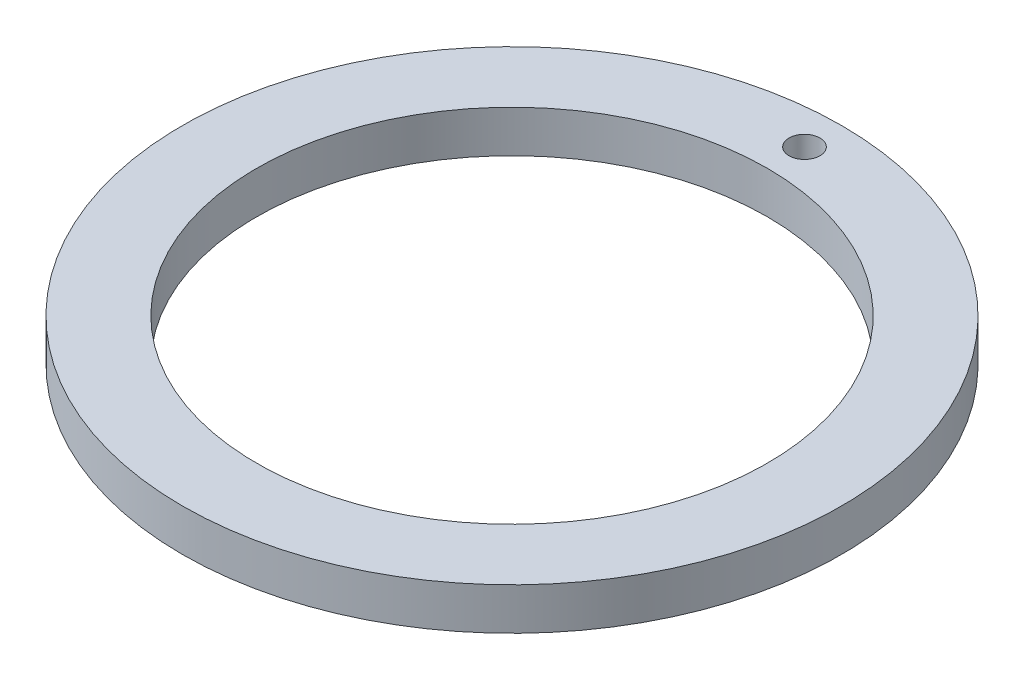
ISO-10303-21;
HEADER;
FILE_DESCRIPTION(('STEP AP214'),'2;1');
FILE_NAME('part.step','',(''),(''),'','','');
FILE_SCHEMA(('AUTOMOTIVE_DESIGN { 1 0 10303 214 1 1 1 1 }'));
ENDSEC;
DATA;
#1=APPLICATION_CONTEXT('core data for automotive mechanical design processes');
#2=APPLICATION_PROTOCOL_DEFINITION('international standard','automotive_design',2000,#1);
#3=PRODUCT_CONTEXT('',#1,'mechanical');
#4=PRODUCT('Part','Part','',(#3));
#5=PRODUCT_RELATED_PRODUCT_CATEGORY('part','',(#4));
#6=PRODUCT_DEFINITION_FORMATION('','',#4);
#7=PRODUCT_DEFINITION_CONTEXT('part definition',#1,'design');
#8=PRODUCT_DEFINITION('design','',#6,#7);
#9=PRODUCT_DEFINITION_SHAPE('','',#8);
#10=(LENGTH_UNIT() NAMED_UNIT(*) SI_UNIT(.MILLI.,.METRE.));
#11=(NAMED_UNIT(*) PLANE_ANGLE_UNIT() SI_UNIT($,.RADIAN.));
#12=(NAMED_UNIT(*) SI_UNIT($,.STERADIAN.) SOLID_ANGLE_UNIT());
#13=UNCERTAINTY_MEASURE_WITH_UNIT(LENGTH_MEASURE(1.E-05),#10,'distance_accuracy_value','');
#14=(GEOMETRIC_REPRESENTATION_CONTEXT(3) GLOBAL_UNCERTAINTY_ASSIGNED_CONTEXT((#13)) GLOBAL_UNIT_ASSIGNED_CONTEXT((#10,
#11,#12)) REPRESENTATION_CONTEXT('',''));
#15=CARTESIAN_POINT('',(0.,0.,0.));
#16=DIRECTION('',(0.,0.,1.));
#17=DIRECTION('',(1.,0.,0.));
#18=AXIS2_PLACEMENT_3D('',#15,#16,#17);
#19=CARTESIAN_POINT('',(0.,6.477,0.));
#20=DIRECTION('',(0.,-1.,0.));
#21=DIRECTION('',(0.,0.,-1.));
#22=AXIS2_PLACEMENT_3D('',#19,#20,#21);
#23=CYLINDRICAL_SURFACE('',#22,50.8);
#24=CARTESIAN_POINT('',(0.,6.477,0.));
#25=DIRECTION('',(0.,1.,0.));
#26=DIRECTION('',(0.,0.,1.));
#27=AXIS2_PLACEMENT_3D('',#24,#25,#26);
#28=CIRCLE('',#27,50.8);
#29=CARTESIAN_POINT('',(0.,6.477,50.8));
#30=VERTEX_POINT('',#29);
#31=EDGE_CURVE('E10',#30,#30,#28,.T.);
#32=ORIENTED_EDGE('',*,*,#31,.F.);
#33=EDGE_LOOP('',(#32));
#34=FACE_BOUND('',#33,.T.);
#35=CARTESIAN_POINT('',(0.,0.,0.));
#36=DIRECTION('',(0.,1.,0.));
#37=DIRECTION('',(0.,0.,1.));
#38=AXIS2_PLACEMENT_3D('',#35,#36,#37);
#39=CIRCLE('',#38,50.8);
#40=CARTESIAN_POINT('',(0.,0.,50.8));
#41=VERTEX_POINT('',#40);
#42=EDGE_CURVE('E42',#41,#41,#39,.T.);
#43=ORIENTED_EDGE('',*,*,#42,.T.);
#44=EDGE_LOOP('',(#43));
#45=FACE_BOUND('',#44,.T.);
#46=ADVANCED_FACE('F39',(#34,#45),#23,.T.);
#47=CARTESIAN_POINT('',(0.,6.477,0.));
#48=DIRECTION('',(0.,1.,0.));
#49=DIRECTION('',(0.,0.,1.));
#50=AXIS2_PLACEMENT_3D('',#47,#48,#49);
#51=PLANE('',#50);
#52=CARTESIAN_POINT('',(0.,6.477,-45.085));
#53=DIRECTION('',(0.,-1.,0.));
#54=DIRECTION('',(0.,0.,-1.));
#55=AXIS2_PLACEMENT_3D('',#52,#53,#54);
#56=CIRCLE('',#55,2.38125);
#57=CARTESIAN_POINT('',(0.,6.477,-47.46625));
#58=VERTEX_POINT('',#57);
#59=EDGE_CURVE('E57',#58,#58,#56,.T.);
#60=ORIENTED_EDGE('',*,*,#59,.T.);
#61=EDGE_LOOP('',(#60));
#62=FACE_BOUND('',#61,.T.);
#63=CARTESIAN_POINT('',(0.,6.477,0.));
#64=DIRECTION('',(0.,-1.,0.));
#65=DIRECTION('',(0.,0.,-1.));
#66=AXIS2_PLACEMENT_3D('',#63,#64,#65);
#67=CIRCLE('',#66,39.37);
#68=CARTESIAN_POINT('',(0.,6.477,-39.37));
#69=VERTEX_POINT('',#68);
#70=EDGE_CURVE('E51',#69,#69,#67,.T.);
#71=ORIENTED_EDGE('',*,*,#70,.T.);
#72=EDGE_LOOP('',(#71));
#73=FACE_BOUND('',#72,.T.);
#74=ORIENTED_EDGE('',*,*,#31,.T.);
#75=EDGE_LOOP('',(#74));
#76=FACE_BOUND('',#75,.T.);
#77=ADVANCED_FACE('F69',(#62,#73,#76),#51,.T.);
#78=CARTESIAN_POINT('',(0.,0.,0.));
#79=DIRECTION('',(0.,1.,0.));
#80=DIRECTION('',(0.,0.,1.));
#81=AXIS2_PLACEMENT_3D('',#78,#79,#80);
#82=PLANE('',#81);
#83=CARTESIAN_POINT('',(0.,0.,-45.085));
#84=DIRECTION('',(0.,-1.,0.));
#85=DIRECTION('',(0.,0.,-1.));
#86=AXIS2_PLACEMENT_3D('',#83,#84,#85);
#87=CIRCLE('',#86,2.38125);
#88=CARTESIAN_POINT('',(0.,0.,-47.46625));
#89=VERTEX_POINT('',#88);
#90=EDGE_CURVE('E61',#89,#89,#87,.T.);
#91=ORIENTED_EDGE('',*,*,#90,.F.);
#92=EDGE_LOOP('',(#91));
#93=FACE_BOUND('',#92,.T.);
#94=CARTESIAN_POINT('',(0.,0.,0.));
#95=DIRECTION('',(0.,-1.,0.));
#96=DIRECTION('',(0.,0.,-1.));
#97=AXIS2_PLACEMENT_3D('',#94,#95,#96);
#98=CIRCLE('',#97,39.37);
#99=CARTESIAN_POINT('',(0.,0.,-39.37));
#100=VERTEX_POINT('',#99);
#101=EDGE_CURVE('E53',#100,#100,#98,.T.);
#102=ORIENTED_EDGE('',*,*,#101,.F.);
#103=EDGE_LOOP('',(#102));
#104=FACE_BOUND('',#103,.T.);
#105=ORIENTED_EDGE('',*,*,#42,.F.);
#106=EDGE_LOOP('',(#105));
#107=FACE_BOUND('',#106,.T.);
#108=ADVANCED_FACE('F79',(#93,#104,#107),#82,.F.);
#109=CARTESIAN_POINT('',(0.,6.477,0.));
#110=DIRECTION('',(0.,-1.,0.));
#111=DIRECTION('',(0.,0.,-1.));
#112=AXIS2_PLACEMENT_3D('',#109,#110,#111);
#113=CYLINDRICAL_SURFACE('',#112,39.37);
#114=ORIENTED_EDGE('',*,*,#70,.F.);
#115=EDGE_LOOP('',(#114));
#116=FACE_BOUND('',#115,.T.);
#117=ORIENTED_EDGE('',*,*,#101,.T.);
#118=EDGE_LOOP('',(#117));
#119=FACE_BOUND('',#118,.T.);
#120=ADVANCED_FACE('F75',(#116,#119),#113,.F.);
#121=CARTESIAN_POINT('',(0.,6.477,-45.085));
#122=DIRECTION('',(0.,-1.,0.));
#123=DIRECTION('',(0.,0.,-1.));
#124=AXIS2_PLACEMENT_3D('',#121,#122,#123);
#125=CYLINDRICAL_SURFACE('',#124,2.38125);
#126=ORIENTED_EDGE('',*,*,#59,.F.);
#127=EDGE_LOOP('',(#126));
#128=FACE_BOUND('',#127,.T.);
#129=ORIENTED_EDGE('',*,*,#90,.T.);
#130=EDGE_LOOP('',(#129));
#131=FACE_BOUND('',#130,.T.);
#132=ADVANCED_FACE('F72',(#128,#131),#125,.F.);
#133=CLOSED_SHELL('',(#46,#77,#108,#120,#132));
#134=MANIFOLD_SOLID_BREP('B2',#133);
#135=ADVANCED_BREP_SHAPE_REPRESENTATION('',(#18,#134),#14);
#136=SHAPE_DEFINITION_REPRESENTATION(#9,#135);
ENDSEC;
END-ISO-10303-21;
